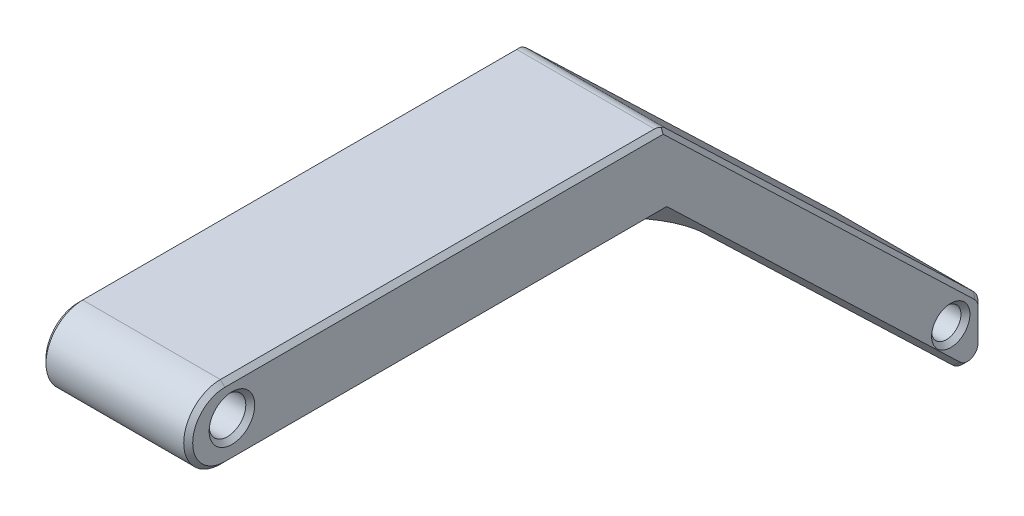
ISO-10303-21;
HEADER;
FILE_DESCRIPTION(('STEP AP214'),'2;1');
FILE_NAME('part.step','',(''),(''),'','','');
FILE_SCHEMA(('AUTOMOTIVE_DESIGN { 1 0 10303 214 1 1 1 1 }'));
ENDSEC;
DATA;
#1=APPLICATION_CONTEXT('core data for automotive mechanical design processes');
#2=APPLICATION_PROTOCOL_DEFINITION('international standard','automotive_design',2000,#1);
#3=PRODUCT_CONTEXT('',#1,'mechanical');
#4=PRODUCT('Part','Part','',(#3));
#5=PRODUCT_RELATED_PRODUCT_CATEGORY('part','',(#4));
#6=PRODUCT_DEFINITION_FORMATION('','',#4);
#7=PRODUCT_DEFINITION_CONTEXT('part definition',#1,'design');
#8=PRODUCT_DEFINITION('design','',#6,#7);
#9=PRODUCT_DEFINITION_SHAPE('','',#8);
#10=(LENGTH_UNIT() NAMED_UNIT(*) SI_UNIT(.MILLI.,.METRE.));
#11=(NAMED_UNIT(*) PLANE_ANGLE_UNIT() SI_UNIT($,.RADIAN.));
#12=(NAMED_UNIT(*) SI_UNIT($,.STERADIAN.) SOLID_ANGLE_UNIT());
#13=UNCERTAINTY_MEASURE_WITH_UNIT(LENGTH_MEASURE(1.E-05),#10,'distance_accuracy_value','');
#14=(GEOMETRIC_REPRESENTATION_CONTEXT(3) GLOBAL_UNCERTAINTY_ASSIGNED_CONTEXT((#13)) GLOBAL_UNIT_ASSIGNED_CONTEXT((#10,
#11,#12)) REPRESENTATION_CONTEXT('',''));
#15=CARTESIAN_POINT('',(0.,0.,0.));
#16=DIRECTION('',(0.,0.,1.));
#17=DIRECTION('',(1.,0.,0.));
#18=AXIS2_PLACEMENT_3D('',#15,#16,#17);
#19=CARTESIAN_POINT('',(6.90909090909091,9.51286258087878,27.7203387676644));
#20=DIRECTION('',(0.,-1.,0.));
#21=DIRECTION('',(0.,0.,-1.));
#22=AXIS2_PLACEMENT_3D('',#19,#20,#21);
#23=PLANE('',#22);
#24=DIRECTION('',(0.,0.,-1.));
#25=VECTOR('',#24,1.);
#26=CARTESIAN_POINT('',(6.60909090909092,9.51286258087878,-1.73420668688105));
#27=LINE('',#26,#25);
#28=CARTESIAN_POINT('',(6.60909090909092,9.51286258087878,27.7203387676644));
#29=VERTEX_POINT('',#28);
#30=CARTESIAN_POINT('',(6.60909090909092,9.51286258087878,-1.33205735945214));
#31=VERTEX_POINT('',#30);
#32=EDGE_CURVE('E230',#29,#31,#27,.T.);
#33=ORIENTED_EDGE('',*,*,#32,.T.);
#34=DIRECTION('',(-1.,0.,0.));
#35=VECTOR('',#34,1.);
#36=CARTESIAN_POINT('',(-2.60909090909092,9.51286258087878,-1.33205735945214));
#37=LINE('',#36,#35);
#38=CARTESIAN_POINT('',(-2.60909090909092,9.51286258087878,-1.33205735945214));
#39=VERTEX_POINT('',#38);
#40=EDGE_CURVE('E268',#31,#39,#37,.T.);
#41=ORIENTED_EDGE('',*,*,#40,.T.);
#42=DIRECTION('',(0.,0.,1.));
#43=VECTOR('',#42,1.);
#44=CARTESIAN_POINT('',(-2.60909090909092,9.51286258087878,27.7203387676644));
#45=LINE('',#44,#43);
#46=CARTESIAN_POINT('',(-2.60909090909092,9.51286258087878,27.7203387676644));
#47=VERTEX_POINT('',#46);
#48=EDGE_CURVE('E228',#39,#47,#45,.T.);
#49=ORIENTED_EDGE('',*,*,#48,.T.);
#50=DIRECTION('',(-1.,0.,0.));
#51=VECTOR('',#50,1.);
#52=CARTESIAN_POINT('',(6.90909090909091,9.51286258087878,27.7203387676644));
#53=LINE('',#52,#51);
#54=EDGE_CURVE('E374',#29,#47,#53,.T.);
#55=ORIENTED_EDGE('',*,*,#54,.F.);
#56=EDGE_LOOP('',(#33,#41,#49,#55));
#57=FACE_BOUND('',#56,.T.);
#58=ADVANCED_FACE('F41',(#57),#23,.F.);
#59=CARTESIAN_POINT('',(6.90909090909091,4.60377167178787,27.7203387676644));
#60=DIRECTION('',(0.,1.,0.));
#61=DIRECTION('',(0.,0.,1.));
#62=AXIS2_PLACEMENT_3D('',#59,#60,#61);
#63=PLANE('',#62);
#64=DIRECTION('',(0.,0.,-1.));
#65=VECTOR('',#64,1.);
#66=CARTESIAN_POINT('',(-2.60909090909092,4.60377167178787,27.7203387676644));
#67=LINE('',#66,#65);
#68=CARTESIAN_POINT('',(-2.60909090909092,4.60377167178787,27.7203387676644));
#69=VERTEX_POINT('',#68);
#70=CARTESIAN_POINT('',(-2.60909090909092,4.60377167178787,2.28728658740802));
#71=VERTEX_POINT('',#70);
#72=EDGE_CURVE('E219',#69,#71,#67,.T.);
#73=ORIENTED_EDGE('',*,*,#72,.T.);
#74=DIRECTION('',(-1.,0.,0.));
#75=VECTOR('',#74,1.);
#76=CARTESIAN_POINT('',(6.90909090909091,4.60377167178787,2.28728658740802));
#77=LINE('',#76,#75);
#78=CARTESIAN_POINT('',(6.60909090909092,4.60377167178787,2.28728658740802));
#79=VERTEX_POINT('',#78);
#80=EDGE_CURVE('E320',#71,#79,#77,.F.);
#81=ORIENTED_EDGE('',*,*,#80,.T.);
#82=DIRECTION('',(0.,0.,1.));
#83=VECTOR('',#82,1.);
#84=CARTESIAN_POINT('',(6.60909090909092,4.60377167178787,27.7203387676644));
#85=LINE('',#84,#83);
#86=CARTESIAN_POINT('',(6.60909090909092,4.60377167178787,27.7203387676644));
#87=VERTEX_POINT('',#86);
#88=EDGE_CURVE('E222',#79,#87,#85,.T.);
#89=ORIENTED_EDGE('',*,*,#88,.T.);
#90=DIRECTION('',(-1.,0.,0.));
#91=VECTOR('',#90,1.);
#92=CARTESIAN_POINT('',(6.90909090909091,4.60377167178787,27.7203387676644));
#93=LINE('',#92,#91);
#94=EDGE_CURVE('E377',#87,#69,#93,.T.);
#95=ORIENTED_EDGE('',*,*,#94,.T.);
#96=EDGE_LOOP('',(#73,#81,#89,#95));
#97=FACE_BOUND('',#96,.T.);
#98=ADVANCED_FACE('F405',(#97),#63,.F.);
#99=CARTESIAN_POINT('',(6.90909090909091,-4.41515636109603,-4.61643809183972));
#100=DIRECTION('',(1.,0.,0.));
#101=DIRECTION('',(0.,0.,-1.));
#102=AXIS2_PLACEMENT_3D('',#99,#100,#101);
#103=PLANE('',#102);
#104=DIRECTION('',(0.,-0.692331912224497,-0.72157918714135));
#105=VECTOR('',#104,1.);
#106=CARTESIAN_POINT('',(6.90909090909091,-0.942621480412595,-7.94822309486099));
#107=LINE('',#106,#105);
#108=CARTESIAN_POINT('',(6.90909090909091,4.90377167178787,-1.85485148510972));
#109=VERTEX_POINT('',#108);
#110=CARTESIAN_POINT('',(6.90909090909091,-13.9483385682594,-21.5033613150327));
#111=VERTEX_POINT('',#110);
#112=EDGE_CURVE('E204',#109,#111,#107,.T.);
#113=ORIENTED_EDGE('',*,*,#112,.T.);
#114=CARTESIAN_POINT('',(6.90909090909091,-13.4432331372605,-21.9879936535899));
#115=DIRECTION('',(1.,0.,0.));
#116=DIRECTION('',(0.,0.,-1.));
#117=AXIS2_PLACEMENT_3D('',#114,#115,#116);
#118=CIRCLE('',#117,0.700000000000006);
#119=CARTESIAN_POINT('',(6.90909090909091,-13.4432331372605,-22.6879936535899));
#120=VERTEX_POINT('',#119);
#121=EDGE_CURVE('E184',#111,#120,#118,.T.);
#122=ORIENTED_EDGE('',*,*,#121,.T.);
#123=DIRECTION('',(0.,1.,0.));
#124=VECTOR('',#123,1.);
#125=CARTESIAN_POINT('',(6.90909090909091,-4.41515636109603,-22.6879936535899));
#126=LINE('',#125,#124);
#127=CARTESIAN_POINT('',(6.90909090909091,-11.3058407965877,-22.6879936535899));
#128=VERTEX_POINT('',#127);
#129=EDGE_CURVE('E193',#120,#128,#126,.T.);
#130=ORIENTED_EDGE('',*,*,#129,.T.);
#131=CARTESIAN_POINT('',(6.90909090909091,-11.3058407965877,-21.9879936535899));
#132=DIRECTION('',(1.,0.,0.));
#133=DIRECTION('',(0.,0.,-1.));
#134=AXIS2_PLACEMENT_3D('',#131,#132,#133);
#135=CIRCLE('',#134,0.700000000000008);
#136=CARTESIAN_POINT('',(6.90909090909091,-10.8007353655887,-22.472625992147));
#137=VERTEX_POINT('',#136);
#138=EDGE_CURVE('E199',#128,#137,#135,.T.);
#139=ORIENTED_EDGE('',*,*,#138,.T.);
#140=DIRECTION('',(0.,0.692331912224497,0.72157918714135));
#141=VECTOR('',#140,1.);
#142=CARTESIAN_POINT('',(6.90909090909091,1.18047939448813,-9.98526977630524));
#143=LINE('',#142,#141);
#144=CARTESIAN_POINT('',(6.90909090909091,9.21286258087878,-1.61356188865238));
#145=VERTEX_POINT('',#144);
#146=EDGE_CURVE('E357',#137,#145,#143,.T.);
#147=ORIENTED_EDGE('',*,*,#146,.T.);
#148=DIRECTION('',(0.,0.,1.));
#149=VECTOR('',#148,1.);
#150=CARTESIAN_POINT('',(6.90909090909091,9.21286258087878,27.7203387676644));
#151=LINE('',#150,#149);
#152=CARTESIAN_POINT('',(6.90909090909091,9.21286258087878,27.7203387676644));
#153=VERTEX_POINT('',#152);
#154=EDGE_CURVE('E360',#145,#153,#151,.T.);
#155=ORIENTED_EDGE('',*,*,#154,.T.);
#156=CARTESIAN_POINT('',(6.90909090909091,7.05831712633333,27.7203387676644));
#157=DIRECTION('',(1.,0.,0.));
#158=DIRECTION('',(0.,0.,-1.));
#159=AXIS2_PLACEMENT_3D('',#156,#157,#158);
#160=CIRCLE('',#159,2.15454545454546);
#161=CARTESIAN_POINT('',(6.90909090909091,4.90377167178787,27.7203387676644));
#162=VERTEX_POINT('',#161);
#163=EDGE_CURVE('E362',#153,#162,#160,.T.);
#164=ORIENTED_EDGE('',*,*,#163,.T.);
#165=DIRECTION('',(0.,0.,-1.));
#166=VECTOR('',#165,1.);
#167=CARTESIAN_POINT('',(6.90909090909091,4.90377167178787,-1.73420668688105));
#168=LINE('',#167,#166);
#169=EDGE_CURVE('E209',#162,#109,#168,.T.);
#170=ORIENTED_EDGE('',*,*,#169,.T.);
#171=EDGE_LOOP('',(#113,#122,#130,#139,#147,#155,#164,#170));
#172=FACE_BOUND('',#171,.T.);
#173=CARTESIAN_POINT('',(6.90909090909091,7.18970593219195,27.2473390665733));
#174=DIRECTION('',(1.,0.,0.));
#175=DIRECTION('',(0.,0.,-1.));
#176=AXIS2_PLACEMENT_3D('',#173,#174,#175);
#177=CIRCLE('',#176,1.52727272727272);
#178=CARTESIAN_POINT('',(6.90909090909091,7.18970593219195,25.7200663393006));
#179=VERTEX_POINT('',#178);
#180=EDGE_CURVE('E200',#179,#179,#177,.F.);
#181=ORIENTED_EDGE('',*,*,#180,.T.);
#182=EDGE_LOOP('',(#181));
#183=FACE_BOUND('',#182,.T.);
#184=CARTESIAN_POINT('',(6.90909090909091,-11.4915527887657,-20.864279334639));
#185=DIRECTION('',(1.,0.,0.));
#186=DIRECTION('',(0.,0.,-1.));
#187=AXIS2_PLACEMENT_3D('',#184,#185,#186);
#188=CIRCLE('',#187,1.28181818181819);
#189=CARTESIAN_POINT('',(6.90909090909091,-11.4915527887657,-22.1460975164571));
#190=VERTEX_POINT('',#189);
#191=EDGE_CURVE('E344',#190,#190,#188,.F.);
#192=ORIENTED_EDGE('',*,*,#191,.T.);
#193=EDGE_LOOP('',(#192));
#194=FACE_BOUND('',#193,.T.);
#195=ADVANCED_FACE('F202',(#172,#183,#194),#103,.T.);
#196=CARTESIAN_POINT('',(-2.90909090909091,-4.41515636109603,-4.61643809183972));
#197=DIRECTION('',(1.,0.,0.));
#198=DIRECTION('',(0.,0.,-1.));
#199=AXIS2_PLACEMENT_3D('',#196,#197,#198);
#200=PLANE('',#199);
#201=DIRECTION('',(0.,0.,-1.));
#202=VECTOR('',#201,1.);
#203=CARTESIAN_POINT('',(-2.90909090909091,9.21286258087878,-4.61643809183972));
#204=LINE('',#203,#202);
#205=CARTESIAN_POINT('',(-2.90909090909091,9.21286258087878,27.7203387676644));
#206=VERTEX_POINT('',#205);
#207=CARTESIAN_POINT('',(-2.90909090909091,9.21286258087878,-1.61356188865238));
#208=VERTEX_POINT('',#207);
#209=EDGE_CURVE('E260',#206,#208,#204,.T.);
#210=ORIENTED_EDGE('',*,*,#209,.T.);
#211=DIRECTION('',(0.,-0.692331912224497,-0.72157918714135));
#212=VECTOR('',#211,1.);
#213=CARTESIAN_POINT('',(-2.90909090909091,-10.8007353655887,-22.472625992147));
#214=LINE('',#213,#212);
#215=CARTESIAN_POINT('',(-2.90909090909091,-10.8007353655888,-22.472625992147));
#216=VERTEX_POINT('',#215);
#217=EDGE_CURVE('E266',#208,#216,#214,.T.);
#218=ORIENTED_EDGE('',*,*,#217,.T.);
#219=CARTESIAN_POINT('',(-2.90909090909091,-11.3058407965877,-21.9879936535899));
#220=DIRECTION('',(1.,0.,0.));
#221=DIRECTION('',(0.,0.,-1.));
#222=AXIS2_PLACEMENT_3D('',#219,#220,#221);
#223=CIRCLE('',#222,0.699999999999999);
#224=CARTESIAN_POINT('',(-2.90909090909091,-11.3058407965877,-22.6879936535899));
#225=VERTEX_POINT('',#224);
#226=EDGE_CURVE('E264',#216,#225,#223,.F.);
#227=ORIENTED_EDGE('',*,*,#226,.T.);
#228=DIRECTION('',(0.,-1.,0.));
#229=VECTOR('',#228,1.);
#230=CARTESIAN_POINT('',(-2.90909090909091,-13.4432331372605,-22.6879936535899));
#231=LINE('',#230,#229);
#232=CARTESIAN_POINT('',(-2.90909090909091,-13.4432331372605,-22.6879936535899));
#233=VERTEX_POINT('',#232);
#234=EDGE_CURVE('E262',#225,#233,#231,.T.);
#235=ORIENTED_EDGE('',*,*,#234,.T.);
#236=CARTESIAN_POINT('',(-2.90909090909091,-13.4432331372605,-21.9879936535899));
#237=DIRECTION('',(1.,0.,0.));
#238=DIRECTION('',(0.,0.,-1.));
#239=AXIS2_PLACEMENT_3D('',#236,#237,#238);
#240=CIRCLE('',#239,0.699999999999998);
#241=CARTESIAN_POINT('',(-2.90909090909091,-13.9483385682594,-21.5033613150327));
#242=VERTEX_POINT('',#241);
#243=EDGE_CURVE('E258',#233,#242,#240,.F.);
#244=ORIENTED_EDGE('',*,*,#243,.T.);
#245=DIRECTION('',(0.,0.692331912224497,0.72157918714135));
#246=VECTOR('',#245,1.);
#247=CARTESIAN_POINT('',(-2.90909090909091,4.82024542793028,-1.9419062605484));
#248=LINE('',#247,#246);
#249=CARTESIAN_POINT('',(-2.90909090909091,4.90377167178787,-1.85485148510972));
#250=VERTEX_POINT('',#249);
#251=EDGE_CURVE('E254',#242,#250,#248,.T.);
#252=ORIENTED_EDGE('',*,*,#251,.T.);
#253=DIRECTION('',(0.,0.,1.));
#254=VECTOR('',#253,1.);
#255=CARTESIAN_POINT('',(-2.90909090909091,4.90377167178787,-4.61643809183972));
#256=LINE('',#255,#254);
#257=CARTESIAN_POINT('',(-2.90909090909091,4.90377167178787,27.7203387676644));
#258=VERTEX_POINT('',#257);
#259=EDGE_CURVE('E252',#250,#258,#256,.T.);
#260=ORIENTED_EDGE('',*,*,#259,.T.);
#261=CARTESIAN_POINT('',(-2.90909090909091,7.05831712633333,27.7203387676644));
#262=DIRECTION('',(1.,0.,0.));
#263=DIRECTION('',(0.,0.,-1.));
#264=AXIS2_PLACEMENT_3D('',#261,#262,#263);
#265=CIRCLE('',#264,2.15454545454545);
#266=EDGE_CURVE('E256',#258,#206,#265,.F.);
#267=ORIENTED_EDGE('',*,*,#266,.T.);
#268=EDGE_LOOP('',(#210,#218,#227,#235,#244,#252,#260,#267));
#269=FACE_BOUND('',#268,.T.);
#270=CARTESIAN_POINT('',(-2.90909090909091,-11.4915527887657,-20.864279334639));
#271=DIRECTION('',(1.,0.,0.));
#272=DIRECTION('',(0.,0.,-1.));
#273=AXIS2_PLACEMENT_3D('',#270,#271,#272);
#274=CIRCLE('',#273,0.981818181818183);
#275=CARTESIAN_POINT('',(-2.90909090909091,-11.4915527887657,-21.8460975164571));
#276=VERTEX_POINT('',#275);
#277=EDGE_CURVE('E284',#276,#276,#274,.T.);
#278=ORIENTED_EDGE('',*,*,#277,.T.);
#279=EDGE_LOOP('',(#278));
#280=FACE_BOUND('',#279,.T.);
#281=CARTESIAN_POINT('',(-2.90909090909091,7.18970593219195,27.2473390665733));
#282=DIRECTION('',(1.,0.,0.));
#283=DIRECTION('',(0.,0.,-1.));
#284=AXIS2_PLACEMENT_3D('',#281,#282,#283);
#285=CIRCLE('',#284,1.22727272727273);
#286=CARTESIAN_POINT('',(-2.90909090909091,7.18970593219195,26.0200663393006));
#287=VERTEX_POINT('',#286);
#288=EDGE_CURVE('E406',#287,#287,#285,.T.);
#289=ORIENTED_EDGE('',*,*,#288,.T.);
#290=EDGE_LOOP('',(#289));
#291=FACE_BOUND('',#290,.T.);
#292=ADVANCED_FACE('F433',(#269,#280,#291),#200,.F.);
#293=CARTESIAN_POINT('',(-2.90909090909091,9.51286258087878,-1.73420668688105));
#294=DIRECTION('',(0.,0.72157918714135,-0.692331912224497));
#295=DIRECTION('',(0.,0.692331912224497,0.72157918714135));
#296=AXIS2_PLACEMENT_3D('',#293,#294,#295);
#297=PLANE('',#296);
#298=DIRECTION('',(0.,0.692331912224497,0.72157918714135));
#299=VECTOR('',#298,1.);
#300=CARTESIAN_POINT('',(-2.60909090909091,9.51286258087878,-1.73420668688105));
#301=LINE('',#300,#299);
#302=CARTESIAN_POINT('',(-2.60909090909091,-10.5842616094463,-22.6803255658144));
#303=VERTEX_POINT('',#302);
#304=CARTESIAN_POINT('',(-2.60909090909091,9.23444176802013,-2.02438927167664));
#305=VERTEX_POINT('',#304);
#306=EDGE_CURVE('E233',#303,#305,#301,.T.);
#307=ORIENTED_EDGE('',*,*,#306,.T.);
#308=DIRECTION('',(-1.,0.,0.));
#309=VECTOR('',#308,1.);
#310=CARTESIAN_POINT('',(6.60909090909092,9.23444176802013,-2.02438927167664));
#311=LINE('',#310,#309);
#312=CARTESIAN_POINT('',(6.60909090909092,9.23444176802013,-2.02438927167664));
#313=VERTEX_POINT('',#312);
#314=EDGE_CURVE('E311',#305,#313,#311,.F.);
#315=ORIENTED_EDGE('',*,*,#314,.T.);
#316=DIRECTION('',(0.,-0.692331912224497,-0.72157918714135));
#317=VECTOR('',#316,1.);
#318=CARTESIAN_POINT('',(6.60909090909092,9.51286258087878,-1.73420668688105));
#319=LINE('',#318,#317);
#320=CARTESIAN_POINT('',(6.60909090909092,-10.5842616094463,-22.6803255658144));
#321=VERTEX_POINT('',#320);
#322=EDGE_CURVE('E236',#313,#321,#319,.T.);
#323=ORIENTED_EDGE('',*,*,#322,.T.);
#324=DIRECTION('',(1.,0.,0.));
#325=VECTOR('',#324,1.);
#326=CARTESIAN_POINT('',(-2.90909090909091,-10.5842616094463,-22.6803255658144));
#327=LINE('',#326,#325);
#328=EDGE_CURVE('E345',#321,#303,#327,.F.);
#329=ORIENTED_EDGE('',*,*,#328,.T.);
#330=EDGE_LOOP('',(#307,#315,#323,#329));
#331=FACE_BOUND('',#330,.T.);
#332=ADVANCED_FACE('F667',(#331),#297,.T.);
#333=CARTESIAN_POINT('',(-2.90909090909091,-10.87945919737,-22.9879936535899));
#334=DIRECTION('',(0.,0.,-1.));
#335=DIRECTION('',(-1.,0.,0.));
#336=AXIS2_PLACEMENT_3D('',#333,#334,#335);
#337=PLANE('',#336);
#338=DIRECTION('',(1.,0.,0.));
#339=VECTOR('',#338,1.);
#340=CARTESIAN_POINT('',(-2.90909090909091,-11.3058407965877,-22.9879936535899));
#341=LINE('',#340,#339);
#342=CARTESIAN_POINT('',(-2.60909090909091,-11.3058407965877,-22.9879936535899));
#343=VERTEX_POINT('',#342);
#344=CARTESIAN_POINT('',(6.60909090909092,-11.3058407965877,-22.9879936535899));
#345=VERTEX_POINT('',#344);
#346=EDGE_CURVE('E350',#343,#345,#341,.T.);
#347=ORIENTED_EDGE('',*,*,#346,.T.);
#348=DIRECTION('',(0.,-1.,0.));
#349=VECTOR('',#348,1.);
#350=CARTESIAN_POINT('',(6.60909090909092,-10.87945919737,-22.9879936535899));
#351=LINE('',#350,#349);
#352=CARTESIAN_POINT('',(6.60909090909092,-13.4432331372605,-22.9879936535899));
#353=VERTEX_POINT('',#352);
#354=EDGE_CURVE('E244',#345,#353,#351,.T.);
#355=ORIENTED_EDGE('',*,*,#354,.T.);
#356=DIRECTION('',(1.,0.,0.));
#357=VECTOR('',#356,1.);
#358=CARTESIAN_POINT('',(-2.90909090909091,-13.4432331372605,-22.9879936535899));
#359=LINE('',#358,#357);
#360=CARTESIAN_POINT('',(-2.60909090909091,-13.4432331372605,-22.9879936535899));
#361=VERTEX_POINT('',#360);
#362=EDGE_CURVE('E382',#353,#361,#359,.F.);
#363=ORIENTED_EDGE('',*,*,#362,.T.);
#364=DIRECTION('',(0.,1.,0.));
#365=VECTOR('',#364,1.);
#366=CARTESIAN_POINT('',(-2.60909090909091,-11.3058407965877,-22.9879936535899));
#367=LINE('',#366,#365);
#368=EDGE_CURVE('E242',#361,#343,#367,.T.);
#369=ORIENTED_EDGE('',*,*,#368,.T.);
#370=EDGE_LOOP('',(#347,#355,#363,#369));
#371=FACE_BOUND('',#370,.T.);
#372=ADVANCED_FACE('F424',(#371),#337,.T.);
#373=CARTESIAN_POINT('',(-2.90909090909091,4.60377167178787,-1.73420668688105));
#374=DIRECTION('',(0.,-0.72157918714135,0.692331912224497));
#375=DIRECTION('',(0.,-0.692331912224497,-0.72157918714135));
#376=AXIS2_PLACEMENT_3D('',#373,#374,#375);
#377=PLANE('',#376);
#378=DIRECTION('',(0.,0.692331912224497,0.72157918714135));
#379=VECTOR('',#378,1.);
#380=CARTESIAN_POINT('',(6.60909090909092,4.60377167178787,-1.73420668688105));
#381=LINE('',#380,#379);
#382=CARTESIAN_POINT('',(6.60909090909092,-14.1648123244018,-21.2956617413654));
#383=VERTEX_POINT('',#382);
#384=CARTESIAN_POINT('',(6.60909090909092,1.81956354320137,-4.63603253483696));
#385=VERTEX_POINT('',#384);
#386=EDGE_CURVE('E216',#383,#385,#381,.T.);
#387=ORIENTED_EDGE('',*,*,#386,.T.);
#388=DIRECTION('',(-1.,0.,0.));
#389=VECTOR('',#388,1.);
#390=CARTESIAN_POINT('',(-2.90909090909091,1.81956354320137,-4.63603253483696));
#391=LINE('',#390,#389);
#392=CARTESIAN_POINT('',(-2.60909090909092,1.81956354320137,-4.63603253483695));
#393=VERTEX_POINT('',#392);
#394=EDGE_CURVE('E317',#385,#393,#391,.T.);
#395=ORIENTED_EDGE('',*,*,#394,.T.);
#396=DIRECTION('',(0.,-0.692331912224497,-0.72157918714135));
#397=VECTOR('',#396,1.);
#398=CARTESIAN_POINT('',(-2.60909090909092,-14.1648123244018,-21.2956617413654));
#399=LINE('',#398,#397);
#400=CARTESIAN_POINT('',(-2.60909090909092,-14.1648123244018,-21.2956617413654));
#401=VERTEX_POINT('',#400);
#402=EDGE_CURVE('E214',#393,#401,#399,.T.);
#403=ORIENTED_EDGE('',*,*,#402,.T.);
#404=DIRECTION('',(1.,0.,0.));
#405=VECTOR('',#404,1.);
#406=CARTESIAN_POINT('',(-2.90909090909091,-14.1648123244018,-21.2956617413654));
#407=LINE('',#406,#405);
#408=EDGE_CURVE('E341',#401,#383,#407,.T.);
#409=ORIENTED_EDGE('',*,*,#408,.T.);
#410=EDGE_LOOP('',(#387,#395,#403,#409));
#411=FACE_BOUND('',#410,.T.);
#412=ADVANCED_FACE('F338',(#411),#377,.T.);
#413=CARTESIAN_POINT('',(-2.90909090909091,7.05831712633333,27.7203387676644));
#414=DIRECTION('',(1.,0.,0.));
#415=DIRECTION('',(0.,0.,-1.));
#416=AXIS2_PLACEMENT_3D('',#413,#414,#415);
#417=CYLINDRICAL_SURFACE('',#416,2.45454545454545);
#418=ORIENTED_EDGE('',*,*,#94,.F.);
#419=CARTESIAN_POINT('',(6.60909090909092,7.05831712633333,27.7203387676644));
#420=DIRECTION('',(1.,0.,0.));
#421=DIRECTION('',(0.,0.,-1.));
#422=AXIS2_PLACEMENT_3D('',#419,#420,#421);
#423=CIRCLE('',#422,2.45454545454545);
#424=EDGE_CURVE('E226',#87,#29,#423,.F.);
#425=ORIENTED_EDGE('',*,*,#424,.T.);
#426=ORIENTED_EDGE('',*,*,#54,.T.);
#427=CARTESIAN_POINT('',(-2.60909090909091,7.05831712633333,27.7203387676644));
#428=DIRECTION('',(1.,0.,0.));
#429=DIRECTION('',(0.,0.,-1.));
#430=AXIS2_PLACEMENT_3D('',#427,#428,#429);
#431=CIRCLE('',#430,2.45454545454545);
#432=EDGE_CURVE('E224',#47,#69,#431,.T.);
#433=ORIENTED_EDGE('',*,*,#432,.T.);
#434=EDGE_LOOP('',(#418,#425,#426,#433));
#435=FACE_BOUND('',#434,.T.);
#436=ADVANCED_FACE('F373',(#435),#417,.T.);
#437=CARTESIAN_POINT('',(-17.6363636363636,7.18970593219195,27.2473390665733));
#438=DIRECTION('',(1.,0.,0.));
#439=DIRECTION('',(0.,0.,-1.));
#440=AXIS2_PLACEMENT_3D('',#437,#438,#439);
#441=CYLINDRICAL_SURFACE('',#440,1.22727272727273);
#442=CARTESIAN_POINT('',(6.60909090909093,7.18970593219195,27.2473390665733));
#443=DIRECTION('',(1.,0.,0.));
#444=DIRECTION('',(0.,0.,-1.));
#445=AXIS2_PLACEMENT_3D('',#442,#443,#444);
#446=CIRCLE('',#445,1.22727272727273);
#447=CARTESIAN_POINT('',(6.60909090909093,7.18970593219195,26.0200663393006));
#448=VERTEX_POINT('',#447);
#449=EDGE_CURVE('E246',#448,#448,#446,.T.);
#450=ORIENTED_EDGE('',*,*,#449,.T.);
#451=EDGE_LOOP('',(#450));
#452=FACE_BOUND('',#451,.T.);
#453=ORIENTED_EDGE('',*,*,#288,.F.);
#454=EDGE_LOOP('',(#453));
#455=FACE_BOUND('',#454,.T.);
#456=ADVANCED_FACE('F435',(#452,#455),#441,.F.);
#457=CARTESIAN_POINT('',(-17.6363636363636,-11.4915527887657,-20.864279334639));
#458=DIRECTION('',(1.,0.,0.));
#459=DIRECTION('',(0.,0.,-1.));
#460=AXIS2_PLACEMENT_3D('',#457,#458,#459);
#461=CYLINDRICAL_SURFACE('',#460,0.981818181818183);
#462=CARTESIAN_POINT('',(6.60909090909091,-11.4915527887657,-20.864279334639));
#463=DIRECTION('',(1.,0.,0.));
#464=DIRECTION('',(0.,0.,-1.));
#465=AXIS2_PLACEMENT_3D('',#462,#463,#464);
#466=CIRCLE('',#465,0.981818181818183);
#467=CARTESIAN_POINT('',(6.60909090909091,-11.4915527887657,-21.8460975164571));
#468=VERTEX_POINT('',#467);
#469=EDGE_CURVE('E249',#468,#468,#466,.T.);
#470=ORIENTED_EDGE('',*,*,#469,.T.);
#471=EDGE_LOOP('',(#470));
#472=FACE_BOUND('',#471,.T.);
#473=ORIENTED_EDGE('',*,*,#277,.F.);
#474=EDGE_LOOP('',(#473));
#475=FACE_BOUND('',#474,.T.);
#476=ADVANCED_FACE('F437',(#472,#475),#461,.F.);
#477=CARTESIAN_POINT('',(-2.90909090909091,-11.3058407965877,-21.9879936535899));
#478=DIRECTION('',(1.,0.,0.));
#479=DIRECTION('',(0.,0.,-1.));
#480=AXIS2_PLACEMENT_3D('',#477,#478,#479);
#481=CYLINDRICAL_SURFACE('',#480,1.);
#482=ORIENTED_EDGE('',*,*,#328,.F.);
#483=CARTESIAN_POINT('',(6.60909090909092,-11.3058407965877,-21.9879936535899));
#484=DIRECTION('',(1.,0.,0.));
#485=DIRECTION('',(0.,0.,-1.));
#486=AXIS2_PLACEMENT_3D('',#483,#484,#485);
#487=CIRCLE('',#486,1.);
#488=EDGE_CURVE('E240',#321,#345,#487,.F.);
#489=ORIENTED_EDGE('',*,*,#488,.T.);
#490=ORIENTED_EDGE('',*,*,#346,.F.);
#491=CARTESIAN_POINT('',(-2.60909090909091,-11.3058407965877,-21.9879936535899));
#492=DIRECTION('',(1.,0.,0.));
#493=DIRECTION('',(0.,0.,-1.));
#494=AXIS2_PLACEMENT_3D('',#491,#492,#493);
#495=CIRCLE('',#494,1.);
#496=EDGE_CURVE('E238',#343,#303,#495,.T.);
#497=ORIENTED_EDGE('',*,*,#496,.T.);
#498=EDGE_LOOP('',(#482,#489,#490,#497));
#499=FACE_BOUND('',#498,.T.);
#500=ADVANCED_FACE('F444',(#499),#481,.T.);
#501=CARTESIAN_POINT('',(-2.90909090909091,-13.4432331372605,-21.9879936535899));
#502=DIRECTION('',(1.,0.,0.));
#503=DIRECTION('',(0.,0.,-1.));
#504=AXIS2_PLACEMENT_3D('',#501,#502,#503);
#505=CYLINDRICAL_SURFACE('',#504,1.);
#506=ORIENTED_EDGE('',*,*,#362,.F.);
#507=CARTESIAN_POINT('',(6.60909090909092,-13.4432331372605,-21.9879936535899));
#508=DIRECTION('',(1.,0.,0.));
#509=DIRECTION('',(0.,0.,-1.));
#510=AXIS2_PLACEMENT_3D('',#507,#508,#509);
#511=CIRCLE('',#510,1.);
#512=EDGE_CURVE('E186',#353,#383,#511,.F.);
#513=ORIENTED_EDGE('',*,*,#512,.T.);
#514=ORIENTED_EDGE('',*,*,#408,.F.);
#515=CARTESIAN_POINT('',(-2.60909090909091,-13.4432331372605,-21.9879936535899));
#516=DIRECTION('',(1.,0.,0.));
#517=DIRECTION('',(0.,0.,-1.));
#518=AXIS2_PLACEMENT_3D('',#515,#516,#517);
#519=CIRCLE('',#518,1.);
#520=EDGE_CURVE('E206',#401,#361,#519,.T.);
#521=ORIENTED_EDGE('',*,*,#520,.T.);
#522=EDGE_LOOP('',(#506,#513,#514,#521));
#523=FACE_BOUND('',#522,.T.);
#524=ADVANCED_FACE('F421',(#523),#505,.T.);
#525=CARTESIAN_POINT('',(6.90909090909091,9.21286258087878,-4.61643809183972));
#526=DIRECTION('',(0.707106781186547,0.707106781186547,0.));
#527=DIRECTION('',(0.,0.,-1.));
#528=AXIS2_PLACEMENT_3D('',#525,#526,#527);
#529=PLANE('',#528);
#530=DIRECTION('',(-0.680142431532467,0.680142431532467,-0.27351882139664));
#531=VECTOR('',#530,1.);
#532=CARTESIAN_POINT('',(9.06741746415761,7.05453602581208,-0.74559231616037));
#533=LINE('',#532,#531);
#534=CARTESIAN_POINT('',(6.68130343689123,9.44065005307846,-1.70516646739421));
#535=VERTEX_POINT('',#534);
#536=EDGE_CURVE('E279',#535,#145,#533,.F.);
#537=ORIENTED_EDGE('',*,*,#536,.F.);
#538=CARTESIAN_POINT('',(7.60909090909092,8.51286258087878,-1.33205735945214));
#539=DIRECTION('',(0.707106781186547,0.707106781186547,0.));
#540=DIRECTION('',(0.707106781186548,-0.707106781186548,0.));
#541=AXIS2_PLACEMENT_3D('',#538,#539,#540);
#542=ELLIPSE('',#541,1.4142135623731,1.);
#543=EDGE_CURVE('E315',#535,#31,#542,.T.);
#544=ORIENTED_EDGE('',*,*,#543,.T.);
#545=ORIENTED_EDGE('',*,*,#32,.F.);
#546=DIRECTION('',(-0.707106781186547,0.707106781186547,0.));
#547=VECTOR('',#546,1.);
#548=CARTESIAN_POINT('',(6.90909090909091,9.21286258087878,27.7203387676644));
#549=LINE('',#548,#547);
#550=EDGE_CURVE('E281',#153,#29,#549,.T.);
#551=ORIENTED_EDGE('',*,*,#550,.F.);
#552=ORIENTED_EDGE('',*,*,#154,.F.);
#553=EDGE_LOOP('',(#537,#544,#545,#551,#552));
#554=FACE_BOUND('',#553,.T.);
#555=ADVANCED_FACE('F386',(#554),#529,.T.);
#556=CARTESIAN_POINT('',(6.90909090909091,7.05831712633333,27.7203387676644));
#557=DIRECTION('',(-1.,0.,0.));
#558=DIRECTION('',(0.,0.,1.));
#559=AXIS2_PLACEMENT_3D('',#556,#557,#558);
#560=CONICAL_SURFACE('',#559,2.15454545454546,0.785398163397449);
#561=ORIENTED_EDGE('',*,*,#550,.T.);
#562=ORIENTED_EDGE('',*,*,#424,.F.);
#563=DIRECTION('',(-0.707106781186547,-0.707106781186547,0.));
#564=VECTOR('',#563,1.);
#565=CARTESIAN_POINT('',(6.90909090909091,4.90377167178787,27.7203387676644));
#566=LINE('',#565,#564);
#567=EDGE_CURVE('E276',#162,#87,#566,.T.);
#568=ORIENTED_EDGE('',*,*,#567,.F.);
#569=ORIENTED_EDGE('',*,*,#163,.F.);
#570=EDGE_LOOP('',(#561,#562,#568,#569));
#571=FACE_BOUND('',#570,.T.);
#572=ADVANCED_FACE('F367',(#571),#560,.T.);
#573=CARTESIAN_POINT('',(6.90909090909091,1.18047939448813,-9.98526977630524));
#574=DIRECTION('',(-0.707106781186546,-0.510233536390726,0.489552589965792));
#575=DIRECTION('',(0.,0.692331912224497,0.72157918714135));
#576=AXIS2_PLACEMENT_3D('',#573,#574,#575);
#577=PLANE('',#576);
#578=ORIENTED_EDGE('',*,*,#322,.F.);
#579=CARTESIAN_POINT('',(7.60909090909092,8.51286258087878,-1.33205735945214));
#580=DIRECTION('',(-0.707106781186546,-0.510233536390726,0.489552589965792));
#581=DIRECTION('',(0.707106781186549,-0.510233536390725,0.489552589965791));
#582=AXIS2_PLACEMENT_3D('',#579,#580,#581);
#583=ELLIPSE('',#582,1.4142135623731,1.);
#584=EDGE_CURVE('E313',#313,#535,#583,.F.);
#585=ORIENTED_EDGE('',*,*,#584,.T.);
#586=ORIENTED_EDGE('',*,*,#536,.T.);
#587=ORIENTED_EDGE('',*,*,#146,.F.);
#588=DIRECTION('',(0.707106781186549,-0.510233536390724,0.489552589965791));
#589=VECTOR('',#588,1.);
#590=CARTESIAN_POINT('',(6.60909090909092,-10.5842616094463,-22.6803255658144));
#591=LINE('',#590,#589);
#592=EDGE_CURVE('E273',#321,#137,#591,.T.);
#593=ORIENTED_EDGE('',*,*,#592,.F.);
#594=EDGE_LOOP('',(#578,#585,#586,#587,#593));
#595=FACE_BOUND('',#594,.T.);
#596=ADVANCED_FACE('F491',(#595),#577,.F.);
#597=CARTESIAN_POINT('',(6.90909090909091,4.90377167178787,-4.61643809183972));
#598=DIRECTION('',(0.707106781186547,-0.707106781186549,0.));
#599=DIRECTION('',(0.,0.,1.));
#600=AXIS2_PLACEMENT_3D('',#597,#598,#599);
#601=PLANE('',#600);
#602=ORIENTED_EDGE('',*,*,#567,.T.);
#603=ORIENTED_EDGE('',*,*,#88,.F.);
#604=CARTESIAN_POINT('',(-3.39090909090911,-5.39622832821213,2.28728658740802));
#605=DIRECTION('',(0.707106781186547,-0.707106781186549,0.));
#606=DIRECTION('',(-0.707106781186549,-0.707106781186547,0.));
#607=AXIS2_PLACEMENT_3D('',#604,#605,#606);
#608=ELLIPSE('',#607,14.142135623731,10.);
#609=CARTESIAN_POINT('',(5.88696563108773,3.88164639378469,-1.44380449201265));
#610=VERTEX_POINT('',#609);
#611=EDGE_CURVE('E49',#79,#610,#608,.F.);
#612=ORIENTED_EDGE('',*,*,#611,.T.);
#613=DIRECTION('',(-0.680142431532467,-0.680142431532465,0.273518821396645));
#614=VECTOR('',#613,1.);
#615=CARTESIAN_POINT('',(5.3381467323821,3.33282749507906,-1.22309734101791));
#616=LINE('',#615,#614);
#617=EDGE_CURVE('E55',#109,#610,#616,.T.);
#618=ORIENTED_EDGE('',*,*,#617,.F.);
#619=ORIENTED_EDGE('',*,*,#169,.F.);
#620=EDGE_LOOP('',(#602,#603,#612,#618,#619));
#621=FACE_BOUND('',#620,.T.);
#622=ADVANCED_FACE('F329',(#621),#601,.T.);
#623=CARTESIAN_POINT('',(6.90909090909091,-11.3058407965877,-21.9879936535899));
#624=DIRECTION('',(-1.,0.,0.));
#625=DIRECTION('',(0.,0.,1.));
#626=AXIS2_PLACEMENT_3D('',#623,#624,#625);
#627=CONICAL_SURFACE('',#626,0.700000000000006,0.785398163397447);
#628=ORIENTED_EDGE('',*,*,#592,.T.);
#629=ORIENTED_EDGE('',*,*,#138,.F.);
#630=DIRECTION('',(0.707106781186547,0.,0.707106781186549));
#631=VECTOR('',#630,1.);
#632=CARTESIAN_POINT('',(6.60909090909092,-11.3058407965877,-22.9879936535899));
#633=LINE('',#632,#631);
#634=EDGE_CURVE('E196',#345,#128,#633,.T.);
#635=ORIENTED_EDGE('',*,*,#634,.F.);
#636=ORIENTED_EDGE('',*,*,#488,.F.);
#637=EDGE_LOOP('',(#628,#629,#635,#636));
#638=FACE_BOUND('',#637,.T.);
#639=ADVANCED_FACE('F479',(#638),#627,.T.);
#640=CARTESIAN_POINT('',(6.90909090909091,-0.942621480412596,-7.94822309486099));
#641=DIRECTION('',(-0.707106781186547,0.510233536390725,-0.489552589965792));
#642=DIRECTION('',(0.,-0.692331912224497,-0.72157918714135));
#643=AXIS2_PLACEMENT_3D('',#640,#641,#642);
#644=PLANE('',#643);
#645=ORIENTED_EDGE('',*,*,#617,.T.);
#646=CARTESIAN_POINT('',(-3.39090909090908,-5.39622832821213,2.28728658740802));
#647=DIRECTION('',(-0.707106781186547,0.510233536390725,-0.489552589965792));
#648=DIRECTION('',(-0.707106781186548,-0.510233536390725,0.489552589965792));
#649=AXIS2_PLACEMENT_3D('',#646,#647,#648);
#650=ELLIPSE('',#649,14.142135623731,10.);
#651=EDGE_CURVE('E11',#610,#385,#650,.T.);
#652=ORIENTED_EDGE('',*,*,#651,.T.);
#653=ORIENTED_EDGE('',*,*,#386,.F.);
#654=DIRECTION('',(-0.707106781186547,-0.510233536390725,0.489552589965792));
#655=VECTOR('',#654,1.);
#656=CARTESIAN_POINT('',(6.90909090909091,-13.9483385682594,-21.5033613150327));
#657=LINE('',#656,#655);
#658=EDGE_CURVE('E189',#111,#383,#657,.T.);
#659=ORIENTED_EDGE('',*,*,#658,.F.);
#660=ORIENTED_EDGE('',*,*,#112,.F.);
#661=EDGE_LOOP('',(#645,#652,#653,#659,#660));
#662=FACE_BOUND('',#661,.T.);
#663=ADVANCED_FACE('F335',(#662),#644,.F.);
#664=CARTESIAN_POINT('',(6.90909090909091,-4.41515636109603,-22.6879936535899));
#665=DIRECTION('',(-0.707106781186549,0.,0.707106781186547));
#666=DIRECTION('',(0.,1.,0.));
#667=AXIS2_PLACEMENT_3D('',#664,#665,#666);
#668=PLANE('',#667);
#669=ORIENTED_EDGE('',*,*,#634,.T.);
#670=ORIENTED_EDGE('',*,*,#129,.F.);
#671=DIRECTION('',(0.707106781186547,0.,0.707106781186549));
#672=VECTOR('',#671,1.);
#673=CARTESIAN_POINT('',(6.60909090909092,-13.4432331372605,-22.9879936535899));
#674=LINE('',#673,#672);
#675=EDGE_CURVE('E180',#353,#120,#674,.T.);
#676=ORIENTED_EDGE('',*,*,#675,.F.);
#677=ORIENTED_EDGE('',*,*,#354,.F.);
#678=EDGE_LOOP('',(#669,#670,#676,#677));
#679=FACE_BOUND('',#678,.T.);
#680=ADVANCED_FACE('F194',(#679),#668,.F.);
#681=CARTESIAN_POINT('',(6.90909090909091,-13.4432331372605,-21.9879936535899));
#682=DIRECTION('',(-1.,0.,0.));
#683=DIRECTION('',(0.,0.,1.));
#684=AXIS2_PLACEMENT_3D('',#681,#682,#683);
#685=CONICAL_SURFACE('',#684,0.700000000000005,0.785398163397449);
#686=ORIENTED_EDGE('',*,*,#658,.T.);
#687=ORIENTED_EDGE('',*,*,#512,.F.);
#688=ORIENTED_EDGE('',*,*,#675,.T.);
#689=ORIENTED_EDGE('',*,*,#121,.F.);
#690=EDGE_LOOP('',(#686,#687,#688,#689));
#691=FACE_BOUND('',#690,.T.);
#692=ADVANCED_FACE('F182',(#691),#685,.T.);
#693=CARTESIAN_POINT('',(6.60909090909093,7.18970593219195,27.2473390665733));
#694=DIRECTION('',(1.,0.,0.));
#695=DIRECTION('',(0.,0.,-1.));
#696=AXIS2_PLACEMENT_3D('',#693,#694,#695);
#697=CONICAL_SURFACE('',#696,1.22727272727273,0.785398163397454);
#698=ORIENTED_EDGE('',*,*,#180,.F.);
#699=EDGE_LOOP('',(#698));
#700=FACE_BOUND('',#699,.T.);
#701=ORIENTED_EDGE('',*,*,#449,.F.);
#702=EDGE_LOOP('',(#701));
#703=FACE_BOUND('',#702,.T.);
#704=ADVANCED_FACE('F468',(#700,#703),#697,.F.);
#705=CARTESIAN_POINT('',(6.60909090909091,-11.4915527887657,-20.864279334639));
#706=DIRECTION('',(1.,0.,0.));
#707=DIRECTION('',(0.,0.,-1.));
#708=AXIS2_PLACEMENT_3D('',#705,#706,#707);
#709=CONICAL_SURFACE('',#708,0.981818181818183,0.785398163397457);
#710=ORIENTED_EDGE('',*,*,#191,.F.);
#711=EDGE_LOOP('',(#710));
#712=FACE_BOUND('',#711,.T.);
#713=ORIENTED_EDGE('',*,*,#469,.F.);
#714=EDGE_LOOP('',(#713));
#715=FACE_BOUND('',#714,.T.);
#716=ADVANCED_FACE('F512',(#712,#715),#709,.F.);
#717=CARTESIAN_POINT('',(-2.60909090909091,4.60377167178787,-1.73420668688105));
#718=DIRECTION('',(-0.707106781186557,-0.510233536390718,0.489552589965785));
#719=DIRECTION('',(0.,0.692331912224497,0.72157918714135));
#720=AXIS2_PLACEMENT_3D('',#717,#718,#719);
#721=PLANE('',#720);
#722=DIRECTION('',(-0.680142431532457,0.680142431532473,-0.273518821396648));
#723=VECTOR('',#722,1.);
#724=CARTESIAN_POINT('',(-2.60909090909091,4.60377167178787,-1.73420668688105));
#725=LINE('',#724,#723);
#726=CARTESIAN_POINT('',(-1.88696563108775,3.88164639378469,-1.44380449201265));
#727=VERTEX_POINT('',#726);
#728=EDGE_CURVE('E63',#250,#727,#725,.F.);
#729=ORIENTED_EDGE('',*,*,#728,.F.);
#730=ORIENTED_EDGE('',*,*,#251,.F.);
#731=DIRECTION('',(-0.707106781186535,0.510233536390732,-0.489552589965802));
#732=VECTOR('',#731,1.);
#733=CARTESIAN_POINT('',(-2.60909090909092,-14.1648123244018,-21.2956617413654));
#734=LINE('',#733,#732);
#735=EDGE_CURVE('E190',#401,#242,#734,.T.);
#736=ORIENTED_EDGE('',*,*,#735,.F.);
#737=ORIENTED_EDGE('',*,*,#402,.F.);
#738=CARTESIAN_POINT('',(7.39090909090883,-5.39622832821213,2.28728658740802));
#739=DIRECTION('',(-0.707106781186557,-0.510233536390718,0.489552589965785));
#740=DIRECTION('',(-0.707106781186538,0.510233536390732,-0.489552589965798));
#741=AXIS2_PLACEMENT_3D('',#738,#739,#740);
#742=ELLIPSE('',#741,14.1421356237308,10.);
#743=EDGE_CURVE('E322',#393,#727,#742,.F.);
#744=ORIENTED_EDGE('',*,*,#743,.T.);
#745=EDGE_LOOP('',(#729,#730,#736,#737,#744));
#746=FACE_BOUND('',#745,.T.);
#747=ADVANCED_FACE('F411',(#746),#721,.T.);
#748=CARTESIAN_POINT('',(-2.90909090909091,-13.4432331372605,-21.9879936535899));
#749=DIRECTION('',(1.,0.,0.));
#750=DIRECTION('',(0.,0.,-1.));
#751=AXIS2_PLACEMENT_3D('',#748,#749,#750);
#752=CONICAL_SURFACE('',#751,0.699999999999998,0.785398163397461);
#753=ORIENTED_EDGE('',*,*,#735,.T.);
#754=ORIENTED_EDGE('',*,*,#243,.F.);
#755=DIRECTION('',(-0.707106781186539,0.,0.707106781186556));
#756=VECTOR('',#755,1.);
#757=CARTESIAN_POINT('',(-2.60909090909091,-13.4432331372605,-22.9879936535899));
#758=LINE('',#757,#756);
#759=EDGE_CURVE('E299',#361,#233,#758,.T.);
#760=ORIENTED_EDGE('',*,*,#759,.F.);
#761=ORIENTED_EDGE('',*,*,#520,.F.);
#762=EDGE_LOOP('',(#753,#754,#760,#761));
#763=FACE_BOUND('',#762,.T.);
#764=ADVANCED_FACE('F417',(#763),#752,.T.);
#765=CARTESIAN_POINT('',(-2.60909090909092,4.60377167178787,27.7203387676644));
#766=DIRECTION('',(0.707106781186556,0.707106781186539,0.));
#767=DIRECTION('',(0.,0.,-1.));
#768=AXIS2_PLACEMENT_3D('',#765,#766,#767);
#769=PLANE('',#768);
#770=ORIENTED_EDGE('',*,*,#728,.T.);
#771=CARTESIAN_POINT('',(7.39090909090885,-5.39622832821213,2.28728658740802));
#772=DIRECTION('',(0.707106781186556,0.707106781186539,0.));
#773=DIRECTION('',(-0.707106781186539,0.707106781186556,0.));
#774=AXIS2_PLACEMENT_3D('',#771,#772,#773);
#775=ELLIPSE('',#774,14.1421356237308,10.);
#776=EDGE_CURVE('E324',#727,#71,#775,.T.);
#777=ORIENTED_EDGE('',*,*,#776,.T.);
#778=ORIENTED_EDGE('',*,*,#72,.F.);
#779=DIRECTION('',(0.707106781186539,-0.707106781186556,0.));
#780=VECTOR('',#779,1.);
#781=CARTESIAN_POINT('',(-2.90909090909091,4.90377167178787,27.7203387676644));
#782=LINE('',#781,#780);
#783=EDGE_CURVE('E296',#258,#69,#782,.T.);
#784=ORIENTED_EDGE('',*,*,#783,.F.);
#785=ORIENTED_EDGE('',*,*,#259,.F.);
#786=EDGE_LOOP('',(#770,#777,#778,#784,#785));
#787=FACE_BOUND('',#786,.T.);
#788=ADVANCED_FACE('F408',(#787),#769,.F.);
#789=CARTESIAN_POINT('',(-2.60909090909091,-10.87945919737,-22.9879936535899));
#790=DIRECTION('',(-0.707106781186556,0.,-0.707106781186539));
#791=DIRECTION('',(0.,-1.,0.));
#792=AXIS2_PLACEMENT_3D('',#789,#790,#791);
#793=PLANE('',#792);
#794=ORIENTED_EDGE('',*,*,#759,.T.);
#795=ORIENTED_EDGE('',*,*,#234,.F.);
#796=DIRECTION('',(-0.707106781186539,0.,0.707106781186556));
#797=VECTOR('',#796,1.);
#798=CARTESIAN_POINT('',(-2.60909090909091,-11.3058407965877,-22.9879936535899));
#799=LINE('',#798,#797);
#800=EDGE_CURVE('E293',#343,#225,#799,.T.);
#801=ORIENTED_EDGE('',*,*,#800,.F.);
#802=ORIENTED_EDGE('',*,*,#368,.F.);
#803=EDGE_LOOP('',(#794,#795,#801,#802));
#804=FACE_BOUND('',#803,.T.);
#805=ADVANCED_FACE('F545',(#804),#793,.T.);
#806=CARTESIAN_POINT('',(-2.60909090909091,7.05831712633333,27.7203387676644));
#807=DIRECTION('',(1.,0.,0.));
#808=DIRECTION('',(0.,0.,-1.));
#809=AXIS2_PLACEMENT_3D('',#806,#807,#808);
#810=CONICAL_SURFACE('',#809,2.45454545454545,0.785398163397461);
#811=ORIENTED_EDGE('',*,*,#783,.T.);
#812=ORIENTED_EDGE('',*,*,#432,.F.);
#813=DIRECTION('',(0.707106781186539,0.707106781186556,0.));
#814=VECTOR('',#813,1.);
#815=CARTESIAN_POINT('',(-2.90909090909091,9.21286258087878,27.7203387676644));
#816=LINE('',#815,#814);
#817=EDGE_CURVE('E290',#206,#47,#816,.T.);
#818=ORIENTED_EDGE('',*,*,#817,.F.);
#819=ORIENTED_EDGE('',*,*,#266,.F.);
#820=EDGE_LOOP('',(#811,#812,#818,#819));
#821=FACE_BOUND('',#820,.T.);
#822=ADVANCED_FACE('F401',(#821),#810,.T.);
#823=CARTESIAN_POINT('',(-2.90909090909091,-11.3058407965877,-21.9879936535899));
#824=DIRECTION('',(1.,0.,0.));
#825=DIRECTION('',(0.,0.,-1.));
#826=AXIS2_PLACEMENT_3D('',#823,#824,#825);
#827=CONICAL_SURFACE('',#826,0.699999999999999,0.785398163397458);
#828=ORIENTED_EDGE('',*,*,#800,.T.);
#829=ORIENTED_EDGE('',*,*,#226,.F.);
#830=DIRECTION('',(-0.70710678118654,-0.510233536390726,0.489552589965801));
#831=VECTOR('',#830,1.);
#832=CARTESIAN_POINT('',(-2.60909090909091,-10.5842616094464,-22.6803255658144));
#833=LINE('',#832,#831);
#834=EDGE_CURVE('E288',#303,#216,#833,.T.);
#835=ORIENTED_EDGE('',*,*,#834,.F.);
#836=ORIENTED_EDGE('',*,*,#496,.F.);
#837=EDGE_LOOP('',(#828,#829,#835,#836));
#838=FACE_BOUND('',#837,.T.);
#839=ADVANCED_FACE('F533',(#838),#827,.T.);
#840=CARTESIAN_POINT('',(-2.60909090909092,9.51286258087878,27.7203387676644));
#841=DIRECTION('',(0.707106781186557,-0.707106781186538,0.));
#842=DIRECTION('',(0.,0.,1.));
#843=AXIS2_PLACEMENT_3D('',#840,#841,#842);
#844=PLANE('',#843);
#845=ORIENTED_EDGE('',*,*,#48,.F.);
#846=CARTESIAN_POINT('',(-3.60909090909089,8.51286258087878,-1.33205735945214));
#847=DIRECTION('',(0.707106781186557,-0.707106781186538,0.));
#848=DIRECTION('',(0.707106781186538,0.707106781186557,0.));
#849=AXIS2_PLACEMENT_3D('',#846,#847,#848);
#850=ELLIPSE('',#849,1.41421356237308,1.);
#851=CARTESIAN_POINT('',(-2.68130343689124,9.44065005307846,-1.70516646739421));
#852=VERTEX_POINT('',#851);
#853=EDGE_CURVE('E307',#39,#852,#850,.F.);
#854=ORIENTED_EDGE('',*,*,#853,.T.);
#855=DIRECTION('',(0.680142431532457,0.680142431532475,-0.273518821396646));
#856=VECTOR('',#855,1.);
#857=CARTESIAN_POINT('',(-8.08857172968114,4.03338176028841,0.469362839778956));
#858=LINE('',#857,#856);
#859=EDGE_CURVE('E285',#208,#852,#858,.T.);
#860=ORIENTED_EDGE('',*,*,#859,.F.);
#861=ORIENTED_EDGE('',*,*,#209,.F.);
#862=ORIENTED_EDGE('',*,*,#817,.T.);
#863=EDGE_LOOP('',(#845,#854,#860,#861,#862));
#864=FACE_BOUND('',#863,.T.);
#865=ADVANCED_FACE('F395',(#864),#844,.F.);
#866=CARTESIAN_POINT('',(-2.60909090909091,9.51286258087878,-1.73420668688105));
#867=DIRECTION('',(-0.707106781186557,0.510233536390719,-0.489552589965785));
#868=DIRECTION('',(0.,-0.692331912224497,-0.72157918714135));
#869=AXIS2_PLACEMENT_3D('',#866,#867,#868);
#870=PLANE('',#869);
#871=ORIENTED_EDGE('',*,*,#859,.T.);
#872=CARTESIAN_POINT('',(-3.60909090909089,8.51286258087878,-1.33205735945214));
#873=DIRECTION('',(-0.707106781186557,0.510233536390719,-0.489552589965785));
#874=DIRECTION('',(0.707106781186538,0.510233536390732,-0.489552589965798));
#875=AXIS2_PLACEMENT_3D('',#872,#873,#874);
#876=ELLIPSE('',#875,1.41421356237308,1.);
#877=EDGE_CURVE('E309',#852,#305,#876,.T.);
#878=ORIENTED_EDGE('',*,*,#877,.T.);
#879=ORIENTED_EDGE('',*,*,#306,.F.);
#880=ORIENTED_EDGE('',*,*,#834,.T.);
#881=ORIENTED_EDGE('',*,*,#217,.F.);
#882=EDGE_LOOP('',(#871,#878,#879,#880,#881));
#883=FACE_BOUND('',#882,.T.);
#884=ADVANCED_FACE('F521',(#883),#870,.T.);
#885=CARTESIAN_POINT('',(6.90909090909091,8.51286258087878,-1.33205735945214));
#886=DIRECTION('',(1.,0.,0.));
#887=DIRECTION('',(0.,0.,-1.));
#888=AXIS2_PLACEMENT_3D('',#885,#886,#887);
#889=CYLINDRICAL_SURFACE('',#888,1.);
#890=ORIENTED_EDGE('',*,*,#584,.F.);
#891=ORIENTED_EDGE('',*,*,#314,.F.);
#892=ORIENTED_EDGE('',*,*,#877,.F.);
#893=ORIENTED_EDGE('',*,*,#853,.F.);
#894=ORIENTED_EDGE('',*,*,#40,.F.);
#895=ORIENTED_EDGE('',*,*,#543,.F.);
#896=EDGE_LOOP('',(#890,#891,#892,#893,#894,#895));
#897=FACE_BOUND('',#896,.T.);
#898=ADVANCED_FACE('F391',(#897),#889,.T.);
#899=CARTESIAN_POINT('',(-2.90909090909091,-5.39622832821213,2.28728658740802));
#900=DIRECTION('',(-1.,0.,0.));
#901=DIRECTION('',(0.,0.,1.));
#902=AXIS2_PLACEMENT_3D('',#899,#900,#901);
#903=CYLINDRICAL_SURFACE('',#902,10.);
#904=ORIENTED_EDGE('',*,*,#611,.F.);
#905=ORIENTED_EDGE('',*,*,#80,.F.);
#906=ORIENTED_EDGE('',*,*,#776,.F.);
#907=ORIENTED_EDGE('',*,*,#743,.F.);
#908=ORIENTED_EDGE('',*,*,#394,.F.);
#909=ORIENTED_EDGE('',*,*,#651,.F.);
#910=EDGE_LOOP('',(#904,#905,#906,#907,#908,#909));
#911=FACE_BOUND('',#910,.T.);
#912=ADVANCED_FACE('F43',(#911),#903,.F.);
#913=CLOSED_SHELL('',(#58,#98,#195,#292,#332,#372,#412,#436,#456,#476,#500,#524,#555,#572,#596,
#622,#639,#663,#680,#692,#704,#716,#747,#764,#788,#805,#822,#839,#865,#884,#898,#912));
#914=MANIFOLD_SOLID_BREP('B2',#913);
#915=ADVANCED_BREP_SHAPE_REPRESENTATION('',(#18,#914),#14);
#916=SHAPE_DEFINITION_REPRESENTATION(#9,#915);
ENDSEC;
END-ISO-10303-21;
